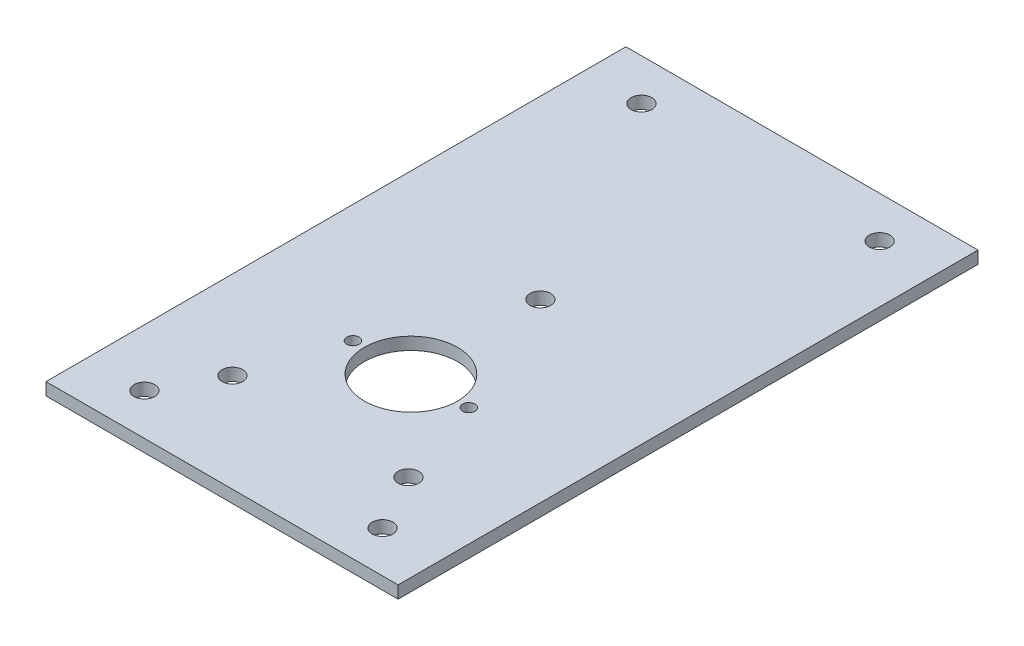
ISO-10303-21;
HEADER;
FILE_DESCRIPTION(('STEP AP214'),'2;1');
FILE_NAME('part.step','',(''),(''),'','','');
FILE_SCHEMA(('AUTOMOTIVE_DESIGN { 1 0 10303 214 1 1 1 1 }'));
ENDSEC;
DATA;
#1=APPLICATION_CONTEXT('core data for automotive mechanical design processes');
#2=APPLICATION_PROTOCOL_DEFINITION('international standard','automotive_design',2000,#1);
#3=PRODUCT_CONTEXT('',#1,'mechanical');
#4=PRODUCT('Part','Part','',(#3));
#5=PRODUCT_RELATED_PRODUCT_CATEGORY('part','',(#4));
#6=PRODUCT_DEFINITION_FORMATION('','',#4);
#7=PRODUCT_DEFINITION_CONTEXT('part definition',#1,'design');
#8=PRODUCT_DEFINITION('design','',#6,#7);
#9=PRODUCT_DEFINITION_SHAPE('','',#8);
#10=(LENGTH_UNIT() NAMED_UNIT(*) SI_UNIT(.MILLI.,.METRE.));
#11=(NAMED_UNIT(*) PLANE_ANGLE_UNIT() SI_UNIT($,.RADIAN.));
#12=(NAMED_UNIT(*) SI_UNIT($,.STERADIAN.) SOLID_ANGLE_UNIT());
#13=UNCERTAINTY_MEASURE_WITH_UNIT(LENGTH_MEASURE(1.E-05),#10,'distance_accuracy_value','');
#14=(GEOMETRIC_REPRESENTATION_CONTEXT(3) GLOBAL_UNCERTAINTY_ASSIGNED_CONTEXT((#13)) GLOBAL_UNIT_ASSIGNED_CONTEXT((#10,
#11,#12)) REPRESENTATION_CONTEXT('',''));
#15=CARTESIAN_POINT('',(0.,0.,0.));
#16=DIRECTION('',(0.,0.,1.));
#17=DIRECTION('',(1.,0.,0.));
#18=AXIS2_PLACEMENT_3D('',#15,#16,#17);
#19=CARTESIAN_POINT('',(85.,6.,140.));
#20=DIRECTION('',(-1.,0.,0.));
#21=DIRECTION('',(0.,0.,1.));
#22=AXIS2_PLACEMENT_3D('',#19,#20,#21);
#23=PLANE('',#22);
#24=DIRECTION('',(0.,0.,-1.));
#25=VECTOR('',#24,1.);
#26=CARTESIAN_POINT('',(85.,0.,140.));
#27=LINE('',#26,#25);
#28=CARTESIAN_POINT('',(85.,0.,140.));
#29=VERTEX_POINT('',#28);
#30=CARTESIAN_POINT('',(85.,0.,-140.));
#31=VERTEX_POINT('',#30);
#32=EDGE_CURVE('E103',#29,#31,#27,.T.);
#33=ORIENTED_EDGE('',*,*,#32,.T.);
#34=DIRECTION('',(0.,-1.,0.));
#35=VECTOR('',#34,1.);
#36=CARTESIAN_POINT('',(85.,6.,-140.));
#37=LINE('',#36,#35);
#38=CARTESIAN_POINT('',(85.,6.,-140.));
#39=VERTEX_POINT('',#38);
#40=EDGE_CURVE('E11',#39,#31,#37,.T.);
#41=ORIENTED_EDGE('',*,*,#40,.F.);
#42=DIRECTION('',(0.,0.,-1.));
#43=VECTOR('',#42,1.);
#44=CARTESIAN_POINT('',(85.,6.,140.));
#45=LINE('',#44,#43);
#46=CARTESIAN_POINT('',(85.,6.,140.));
#47=VERTEX_POINT('',#46);
#48=EDGE_CURVE('E90',#47,#39,#45,.T.);
#49=ORIENTED_EDGE('',*,*,#48,.F.);
#50=DIRECTION('',(0.,-1.,0.));
#51=VECTOR('',#50,1.);
#52=CARTESIAN_POINT('',(85.,6.,140.));
#53=LINE('',#52,#51);
#54=EDGE_CURVE('E99',#47,#29,#53,.T.);
#55=ORIENTED_EDGE('',*,*,#54,.T.);
#56=EDGE_LOOP('',(#33,#41,#49,#55));
#57=FACE_BOUND('',#56,.T.);
#58=ADVANCED_FACE('F37',(#57),#23,.F.);
#59=CARTESIAN_POINT('',(-85.,6.,-140.));
#60=DIRECTION('',(0.,0.,1.));
#61=DIRECTION('',(1.,0.,0.));
#62=AXIS2_PLACEMENT_3D('',#59,#60,#61);
#63=PLANE('',#62);
#64=DIRECTION('',(-1.,0.,0.));
#65=VECTOR('',#64,1.);
#66=CARTESIAN_POINT('',(-85.,0.,-140.));
#67=LINE('',#66,#65);
#68=CARTESIAN_POINT('',(-85.,0.,-140.));
#69=VERTEX_POINT('',#68);
#70=EDGE_CURVE('E94',#31,#69,#67,.T.);
#71=ORIENTED_EDGE('',*,*,#70,.T.);
#72=DIRECTION('',(0.,-1.,0.));
#73=VECTOR('',#72,1.);
#74=CARTESIAN_POINT('',(-85.,6.,-140.));
#75=LINE('',#74,#73);
#76=CARTESIAN_POINT('',(-85.,6.,-140.));
#77=VERTEX_POINT('',#76);
#78=EDGE_CURVE('E46',#77,#69,#75,.T.);
#79=ORIENTED_EDGE('',*,*,#78,.F.);
#80=DIRECTION('',(-1.,0.,0.));
#81=VECTOR('',#80,1.);
#82=CARTESIAN_POINT('',(-85.,6.,-140.));
#83=LINE('',#82,#81);
#84=EDGE_CURVE('E85',#39,#77,#83,.T.);
#85=ORIENTED_EDGE('',*,*,#84,.F.);
#86=ORIENTED_EDGE('',*,*,#40,.T.);
#87=EDGE_LOOP('',(#71,#79,#85,#86));
#88=FACE_BOUND('',#87,.T.);
#89=ADVANCED_FACE('F93',(#88),#63,.F.);
#90=CARTESIAN_POINT('',(-85.,6.,140.));
#91=DIRECTION('',(1.,0.,0.));
#92=DIRECTION('',(0.,0.,-1.));
#93=AXIS2_PLACEMENT_3D('',#90,#91,#92);
#94=PLANE('',#93);
#95=DIRECTION('',(0.,0.,1.));
#96=VECTOR('',#95,1.);
#97=CARTESIAN_POINT('',(-85.,0.,140.));
#98=LINE('',#97,#96);
#99=CARTESIAN_POINT('',(-85.,0.,140.));
#100=VERTEX_POINT('',#99);
#101=EDGE_CURVE('E72',#69,#100,#98,.T.);
#102=ORIENTED_EDGE('',*,*,#101,.T.);
#103=DIRECTION('',(0.,-1.,0.));
#104=VECTOR('',#103,1.);
#105=CARTESIAN_POINT('',(-85.,6.,140.));
#106=LINE('',#105,#104);
#107=CARTESIAN_POINT('',(-85.,6.,140.));
#108=VERTEX_POINT('',#107);
#109=EDGE_CURVE('E95',#108,#100,#106,.T.);
#110=ORIENTED_EDGE('',*,*,#109,.F.);
#111=DIRECTION('',(0.,0.,1.));
#112=VECTOR('',#111,1.);
#113=CARTESIAN_POINT('',(-85.,6.,140.));
#114=LINE('',#113,#112);
#115=EDGE_CURVE('E88',#77,#108,#114,.T.);
#116=ORIENTED_EDGE('',*,*,#115,.F.);
#117=ORIENTED_EDGE('',*,*,#78,.T.);
#118=EDGE_LOOP('',(#102,#110,#116,#117));
#119=FACE_BOUND('',#118,.T.);
#120=ADVANCED_FACE('F97',(#119),#94,.F.);
#121=CARTESIAN_POINT('',(-85.,6.,140.));
#122=DIRECTION('',(0.,0.,-1.));
#123=DIRECTION('',(-1.,0.,0.));
#124=AXIS2_PLACEMENT_3D('',#121,#122,#123);
#125=PLANE('',#124);
#126=DIRECTION('',(1.,0.,0.));
#127=VECTOR('',#126,1.);
#128=CARTESIAN_POINT('',(-85.,0.,140.));
#129=LINE('',#128,#127);
#130=EDGE_CURVE('E78',#100,#29,#129,.T.);
#131=ORIENTED_EDGE('',*,*,#130,.T.);
#132=ORIENTED_EDGE('',*,*,#54,.F.);
#133=DIRECTION('',(1.,0.,0.));
#134=VECTOR('',#133,1.);
#135=CARTESIAN_POINT('',(-85.,6.,140.));
#136=LINE('',#135,#134);
#137=EDGE_CURVE('E55',#108,#47,#136,.T.);
#138=ORIENTED_EDGE('',*,*,#137,.F.);
#139=ORIENTED_EDGE('',*,*,#109,.T.);
#140=EDGE_LOOP('',(#131,#132,#138,#139));
#141=FACE_BOUND('',#140,.T.);
#142=ADVANCED_FACE('F168',(#141),#125,.F.);
#143=CARTESIAN_POINT('',(0.,6.,0.));
#144=DIRECTION('',(0.,-1.,0.));
#145=DIRECTION('',(0.,0.,-1.));
#146=AXIS2_PLACEMENT_3D('',#143,#144,#145);
#147=PLANE('',#146);
#148=CARTESIAN_POINT('',(-28.,6.,48.8));
#149=DIRECTION('',(0.,1.,0.));
#150=DIRECTION('',(0.,0.,1.));
#151=AXIS2_PLACEMENT_3D('',#148,#149,#150);
#152=CIRCLE('',#151,3.);
#153=CARTESIAN_POINT('',(-28.,6.,51.8));
#154=VERTEX_POINT('',#153);
#155=EDGE_CURVE('E310',#154,#154,#152,.T.);
#156=ORIENTED_EDGE('',*,*,#155,.F.);
#157=EDGE_LOOP('',(#156));
#158=FACE_BOUND('',#157,.T.);
#159=CARTESIAN_POINT('',(27.9999999999999,6.,48.8));
#160=DIRECTION('',(0.,1.,0.));
#161=DIRECTION('',(0.,0.,1.));
#162=AXIS2_PLACEMENT_3D('',#159,#160,#161);
#163=CIRCLE('',#162,3.);
#164=CARTESIAN_POINT('',(27.9999999999999,6.,51.8));
#165=VERTEX_POINT('',#164);
#166=EDGE_CURVE('E311',#165,#165,#163,.T.);
#167=ORIENTED_EDGE('',*,*,#166,.F.);
#168=EDGE_LOOP('',(#167));
#169=FACE_BOUND('',#168,.T.);
#170=CARTESIAN_POINT('',(0.,6.,48.8));
#171=DIRECTION('',(0.,1.,0.));
#172=DIRECTION('',(0.,0.,1.));
#173=AXIS2_PLACEMENT_3D('',#170,#171,#172);
#174=CIRCLE('',#173,22.5);
#175=CARTESIAN_POINT('',(0.,6.,71.3));
#176=VERTEX_POINT('',#175);
#177=EDGE_CURVE('E115',#176,#176,#174,.T.);
#178=ORIENTED_EDGE('',*,*,#177,.F.);
#179=EDGE_LOOP('',(#178));
#180=FACE_BOUND('',#179,.T.);
#181=CARTESIAN_POINT('',(57.5,6.,-120.));
#182=DIRECTION('',(0.,1.,0.));
#183=DIRECTION('',(0.,0.,1.));
#184=AXIS2_PLACEMENT_3D('',#181,#182,#183);
#185=CIRCLE('',#184,5.00000000000001);
#186=CARTESIAN_POINT('',(57.5,6.,-115.));
#187=VERTEX_POINT('',#186);
#188=EDGE_CURVE('E137',#187,#187,#185,.T.);
#189=ORIENTED_EDGE('',*,*,#188,.F.);
#190=EDGE_LOOP('',(#189));
#191=FACE_BOUND('',#190,.T.);
#192=CARTESIAN_POINT('',(0.,6.,-13.7));
#193=DIRECTION('',(0.,1.,0.));
#194=DIRECTION('',(0.,0.,1.));
#195=AXIS2_PLACEMENT_3D('',#192,#193,#194);
#196=CIRCLE('',#195,5.);
#197=CARTESIAN_POINT('',(0.,6.,-8.70000000000001));
#198=VERTEX_POINT('',#197);
#199=EDGE_CURVE('E143',#198,#198,#196,.T.);
#200=ORIENTED_EDGE('',*,*,#199,.F.);
#201=EDGE_LOOP('',(#200));
#202=FACE_BOUND('',#201,.T.);
#203=CARTESIAN_POINT('',(-57.5,6.,120.));
#204=DIRECTION('',(0.,1.,0.));
#205=DIRECTION('',(0.,0.,1.));
#206=AXIS2_PLACEMENT_3D('',#203,#204,#205);
#207=CIRCLE('',#206,5.);
#208=CARTESIAN_POINT('',(-57.5,6.,125.));
#209=VERTEX_POINT('',#208);
#210=EDGE_CURVE('E149',#209,#209,#207,.T.);
#211=ORIENTED_EDGE('',*,*,#210,.F.);
#212=EDGE_LOOP('',(#211));
#213=FACE_BOUND('',#212,.T.);
#214=CARTESIAN_POINT('',(57.5000000000001,6.,120.));
#215=DIRECTION('',(0.,1.,0.));
#216=DIRECTION('',(0.,0.,1.));
#217=AXIS2_PLACEMENT_3D('',#214,#215,#216);
#218=CIRCLE('',#217,5.);
#219=CARTESIAN_POINT('',(57.5000000000001,6.,125.));
#220=VERTEX_POINT('',#219);
#221=EDGE_CURVE('E155',#220,#220,#218,.T.);
#222=ORIENTED_EDGE('',*,*,#221,.F.);
#223=EDGE_LOOP('',(#222));
#224=FACE_BOUND('',#223,.T.);
#225=CARTESIAN_POINT('',(42.5,6.,92.5));
#226=DIRECTION('',(0.,1.,0.));
#227=DIRECTION('',(0.,0.,1.));
#228=AXIS2_PLACEMENT_3D('',#225,#226,#227);
#229=CIRCLE('',#228,5.00000000000001);
#230=CARTESIAN_POINT('',(42.5,6.,97.5));
#231=VERTEX_POINT('',#230);
#232=EDGE_CURVE('E129',#231,#231,#229,.T.);
#233=ORIENTED_EDGE('',*,*,#232,.F.);
#234=EDGE_LOOP('',(#233));
#235=FACE_BOUND('',#234,.T.);
#236=CARTESIAN_POINT('',(-42.5,6.,92.5));
#237=DIRECTION('',(0.,1.,0.));
#238=DIRECTION('',(0.,0.,1.));
#239=AXIS2_PLACEMENT_3D('',#236,#237,#238);
#240=CIRCLE('',#239,5.00000000000001);
#241=CARTESIAN_POINT('',(-42.5,6.,97.5));
#242=VERTEX_POINT('',#241);
#243=EDGE_CURVE('E120',#242,#242,#240,.T.);
#244=ORIENTED_EDGE('',*,*,#243,.F.);
#245=EDGE_LOOP('',(#244));
#246=FACE_BOUND('',#245,.T.);
#247=CARTESIAN_POINT('',(-57.5,6.,-120.));
#248=DIRECTION('',(0.,1.,0.));
#249=DIRECTION('',(0.,0.,1.));
#250=AXIS2_PLACEMENT_3D('',#247,#248,#249);
#251=CIRCLE('',#250,5.);
#252=CARTESIAN_POINT('',(-57.5,6.,-115.));
#253=VERTEX_POINT('',#252);
#254=EDGE_CURVE('E136',#253,#253,#251,.T.);
#255=ORIENTED_EDGE('',*,*,#254,.F.);
#256=EDGE_LOOP('',(#255));
#257=FACE_BOUND('',#256,.T.);
#258=ORIENTED_EDGE('',*,*,#48,.T.);
#259=ORIENTED_EDGE('',*,*,#84,.T.);
#260=ORIENTED_EDGE('',*,*,#115,.T.);
#261=ORIENTED_EDGE('',*,*,#137,.T.);
#262=EDGE_LOOP('',(#258,#259,#260,#261));
#263=FACE_BOUND('',#262,.T.);
#264=ADVANCED_FACE('F86',(#158,#169,#180,#191,#202,#213,#224,#235,#246,#257,#263),#147,.F.);
#265=CARTESIAN_POINT('',(0.,0.,0.));
#266=DIRECTION('',(0.,-1.,0.));
#267=DIRECTION('',(0.,0.,-1.));
#268=AXIS2_PLACEMENT_3D('',#265,#266,#267);
#269=PLANE('',#268);
#270=CARTESIAN_POINT('',(-28.,0.,48.8));
#271=DIRECTION('',(0.,-1.,0.));
#272=DIRECTION('',(0.,0.,-1.));
#273=AXIS2_PLACEMENT_3D('',#270,#271,#272);
#274=CIRCLE('',#273,3.);
#275=CARTESIAN_POINT('',(-28.,0.,45.8));
#276=VERTEX_POINT('',#275);
#277=EDGE_CURVE('E40',#276,#276,#274,.T.);
#278=ORIENTED_EDGE('',*,*,#277,.F.);
#279=EDGE_LOOP('',(#278));
#280=FACE_BOUND('',#279,.T.);
#281=CARTESIAN_POINT('',(27.9999999999999,0.,48.8));
#282=DIRECTION('',(0.,-1.,0.));
#283=DIRECTION('',(0.,0.,-1.));
#284=AXIS2_PLACEMENT_3D('',#281,#282,#283);
#285=CIRCLE('',#284,3.);
#286=CARTESIAN_POINT('',(27.9999999999999,0.,45.8));
#287=VERTEX_POINT('',#286);
#288=EDGE_CURVE('E114',#287,#287,#285,.T.);
#289=ORIENTED_EDGE('',*,*,#288,.F.);
#290=EDGE_LOOP('',(#289));
#291=FACE_BOUND('',#290,.T.);
#292=CARTESIAN_POINT('',(0.,0.,48.8));
#293=DIRECTION('',(0.,-1.,0.));
#294=DIRECTION('',(0.,0.,-1.));
#295=AXIS2_PLACEMENT_3D('',#292,#293,#294);
#296=CIRCLE('',#295,22.5);
#297=CARTESIAN_POINT('',(0.,0.,26.3));
#298=VERTEX_POINT('',#297);
#299=EDGE_CURVE('E112',#298,#298,#296,.T.);
#300=ORIENTED_EDGE('',*,*,#299,.F.);
#301=EDGE_LOOP('',(#300));
#302=FACE_BOUND('',#301,.T.);
#303=CARTESIAN_POINT('',(57.5,0.,-120.));
#304=DIRECTION('',(0.,1.,0.));
#305=DIRECTION('',(0.,0.,1.));
#306=AXIS2_PLACEMENT_3D('',#303,#304,#305);
#307=CIRCLE('',#306,5.00000000000001);
#308=CARTESIAN_POINT('',(57.5,0.,-115.));
#309=VERTEX_POINT('',#308);
#310=EDGE_CURVE('E133',#309,#309,#307,.T.);
#311=ORIENTED_EDGE('',*,*,#310,.T.);
#312=EDGE_LOOP('',(#311));
#313=FACE_BOUND('',#312,.T.);
#314=CARTESIAN_POINT('',(0.,0.,-13.7));
#315=DIRECTION('',(0.,1.,0.));
#316=DIRECTION('',(0.,0.,1.));
#317=AXIS2_PLACEMENT_3D('',#314,#315,#316);
#318=CIRCLE('',#317,5.);
#319=CARTESIAN_POINT('',(0.,0.,-8.70000000000001));
#320=VERTEX_POINT('',#319);
#321=EDGE_CURVE('E140',#320,#320,#318,.T.);
#322=ORIENTED_EDGE('',*,*,#321,.T.);
#323=EDGE_LOOP('',(#322));
#324=FACE_BOUND('',#323,.T.);
#325=CARTESIAN_POINT('',(-57.5,0.,120.));
#326=DIRECTION('',(0.,1.,0.));
#327=DIRECTION('',(0.,0.,1.));
#328=AXIS2_PLACEMENT_3D('',#325,#326,#327);
#329=CIRCLE('',#328,5.);
#330=CARTESIAN_POINT('',(-57.5,0.,125.));
#331=VERTEX_POINT('',#330);
#332=EDGE_CURVE('E146',#331,#331,#329,.T.);
#333=ORIENTED_EDGE('',*,*,#332,.T.);
#334=EDGE_LOOP('',(#333));
#335=FACE_BOUND('',#334,.T.);
#336=CARTESIAN_POINT('',(57.5000000000001,0.,120.));
#337=DIRECTION('',(0.,1.,0.));
#338=DIRECTION('',(0.,0.,1.));
#339=AXIS2_PLACEMENT_3D('',#336,#337,#338);
#340=CIRCLE('',#339,5.);
#341=CARTESIAN_POINT('',(57.5000000000001,0.,125.));
#342=VERTEX_POINT('',#341);
#343=EDGE_CURVE('E152',#342,#342,#340,.T.);
#344=ORIENTED_EDGE('',*,*,#343,.T.);
#345=EDGE_LOOP('',(#344));
#346=FACE_BOUND('',#345,.T.);
#347=CARTESIAN_POINT('',(42.5,0.,92.5));
#348=DIRECTION('',(0.,1.,0.));
#349=DIRECTION('',(0.,0.,1.));
#350=AXIS2_PLACEMENT_3D('',#347,#348,#349);
#351=CIRCLE('',#350,5.00000000000001);
#352=CARTESIAN_POINT('',(42.5,0.,97.5));
#353=VERTEX_POINT('',#352);
#354=EDGE_CURVE('E158',#353,#353,#351,.T.);
#355=ORIENTED_EDGE('',*,*,#354,.T.);
#356=EDGE_LOOP('',(#355));
#357=FACE_BOUND('',#356,.T.);
#358=CARTESIAN_POINT('',(-42.5,0.,92.5));
#359=DIRECTION('',(0.,1.,0.));
#360=DIRECTION('',(0.,0.,1.));
#361=AXIS2_PLACEMENT_3D('',#358,#359,#360);
#362=CIRCLE('',#361,5.00000000000001);
#363=CARTESIAN_POINT('',(-42.5,0.,97.5));
#364=VERTEX_POINT('',#363);
#365=EDGE_CURVE('E124',#364,#364,#362,.T.);
#366=ORIENTED_EDGE('',*,*,#365,.T.);
#367=EDGE_LOOP('',(#366));
#368=FACE_BOUND('',#367,.T.);
#369=CARTESIAN_POINT('',(-57.5,0.,-120.));
#370=DIRECTION('',(0.,1.,0.));
#371=DIRECTION('',(0.,0.,1.));
#372=AXIS2_PLACEMENT_3D('',#369,#370,#371);
#373=CIRCLE('',#372,5.);
#374=CARTESIAN_POINT('',(-57.5,0.,-115.));
#375=VERTEX_POINT('',#374);
#376=EDGE_CURVE('E106',#375,#375,#373,.T.);
#377=ORIENTED_EDGE('',*,*,#376,.T.);
#378=EDGE_LOOP('',(#377));
#379=FACE_BOUND('',#378,.T.);
#380=ORIENTED_EDGE('',*,*,#32,.F.);
#381=ORIENTED_EDGE('',*,*,#130,.F.);
#382=ORIENTED_EDGE('',*,*,#101,.F.);
#383=ORIENTED_EDGE('',*,*,#70,.F.);
#384=EDGE_LOOP('',(#380,#381,#382,#383));
#385=FACE_BOUND('',#384,.T.);
#386=ADVANCED_FACE('F167',(#280,#291,#302,#313,#324,#335,#346,#357,#368,#379,#385),#269,.T.);
#387=CARTESIAN_POINT('',(-57.5,0.,-120.));
#388=DIRECTION('',(0.,1.,0.));
#389=DIRECTION('',(0.,0.,1.));
#390=AXIS2_PLACEMENT_3D('',#387,#388,#389);
#391=CYLINDRICAL_SURFACE('',#390,5.);
#392=ORIENTED_EDGE('',*,*,#376,.F.);
#393=EDGE_LOOP('',(#392));
#394=FACE_BOUND('',#393,.T.);
#395=ORIENTED_EDGE('',*,*,#254,.T.);
#396=EDGE_LOOP('',(#395));
#397=FACE_BOUND('',#396,.T.);
#398=ADVANCED_FACE('F164',(#394,#397),#391,.F.);
#399=CARTESIAN_POINT('',(-42.5,0.,92.5));
#400=DIRECTION('',(0.,1.,0.));
#401=DIRECTION('',(0.,0.,1.));
#402=AXIS2_PLACEMENT_3D('',#399,#400,#401);
#403=CYLINDRICAL_SURFACE('',#402,5.00000000000001);
#404=ORIENTED_EDGE('',*,*,#365,.F.);
#405=EDGE_LOOP('',(#404));
#406=FACE_BOUND('',#405,.T.);
#407=ORIENTED_EDGE('',*,*,#243,.T.);
#408=EDGE_LOOP('',(#407));
#409=FACE_BOUND('',#408,.T.);
#410=ADVANCED_FACE('F208',(#406,#409),#403,.F.);
#411=CARTESIAN_POINT('',(42.5,0.,92.5));
#412=DIRECTION('',(0.,1.,0.));
#413=DIRECTION('',(0.,0.,1.));
#414=AXIS2_PLACEMENT_3D('',#411,#412,#413);
#415=CYLINDRICAL_SURFACE('',#414,5.00000000000001);
#416=ORIENTED_EDGE('',*,*,#354,.F.);
#417=EDGE_LOOP('',(#416));
#418=FACE_BOUND('',#417,.T.);
#419=ORIENTED_EDGE('',*,*,#232,.T.);
#420=EDGE_LOOP('',(#419));
#421=FACE_BOUND('',#420,.T.);
#422=ADVANCED_FACE('F218',(#418,#421),#415,.F.);
#423=CARTESIAN_POINT('',(57.5000000000001,0.,120.));
#424=DIRECTION('',(0.,1.,0.));
#425=DIRECTION('',(0.,0.,1.));
#426=AXIS2_PLACEMENT_3D('',#423,#424,#425);
#427=CYLINDRICAL_SURFACE('',#426,5.);
#428=ORIENTED_EDGE('',*,*,#343,.F.);
#429=EDGE_LOOP('',(#428));
#430=FACE_BOUND('',#429,.T.);
#431=ORIENTED_EDGE('',*,*,#221,.T.);
#432=EDGE_LOOP('',(#431));
#433=FACE_BOUND('',#432,.T.);
#434=ADVANCED_FACE('F228',(#430,#433),#427,.F.);
#435=CARTESIAN_POINT('',(-57.5,0.,120.));
#436=DIRECTION('',(0.,1.,0.));
#437=DIRECTION('',(0.,0.,1.));
#438=AXIS2_PLACEMENT_3D('',#435,#436,#437);
#439=CYLINDRICAL_SURFACE('',#438,5.);
#440=ORIENTED_EDGE('',*,*,#332,.F.);
#441=EDGE_LOOP('',(#440));
#442=FACE_BOUND('',#441,.T.);
#443=ORIENTED_EDGE('',*,*,#210,.T.);
#444=EDGE_LOOP('',(#443));
#445=FACE_BOUND('',#444,.T.);
#446=ADVANCED_FACE('F238',(#442,#445),#439,.F.);
#447=CARTESIAN_POINT('',(0.,0.,-13.7));
#448=DIRECTION('',(0.,1.,0.));
#449=DIRECTION('',(0.,0.,1.));
#450=AXIS2_PLACEMENT_3D('',#447,#448,#449);
#451=CYLINDRICAL_SURFACE('',#450,5.);
#452=ORIENTED_EDGE('',*,*,#321,.F.);
#453=EDGE_LOOP('',(#452));
#454=FACE_BOUND('',#453,.T.);
#455=ORIENTED_EDGE('',*,*,#199,.T.);
#456=EDGE_LOOP('',(#455));
#457=FACE_BOUND('',#456,.T.);
#458=ADVANCED_FACE('F248',(#454,#457),#451,.F.);
#459=CARTESIAN_POINT('',(57.5,0.,-120.));
#460=DIRECTION('',(0.,1.,0.));
#461=DIRECTION('',(0.,0.,1.));
#462=AXIS2_PLACEMENT_3D('',#459,#460,#461);
#463=CYLINDRICAL_SURFACE('',#462,5.00000000000001);
#464=ORIENTED_EDGE('',*,*,#310,.F.);
#465=EDGE_LOOP('',(#464));
#466=FACE_BOUND('',#465,.T.);
#467=ORIENTED_EDGE('',*,*,#188,.T.);
#468=EDGE_LOOP('',(#467));
#469=FACE_BOUND('',#468,.T.);
#470=ADVANCED_FACE('F258',(#466,#469),#463,.F.);
#471=CARTESIAN_POINT('',(0.,-4.,48.8));
#472=DIRECTION('',(0.,1.,0.));
#473=DIRECTION('',(0.,0.,1.));
#474=AXIS2_PLACEMENT_3D('',#471,#472,#473);
#475=CYLINDRICAL_SURFACE('',#474,22.5);
#476=ORIENTED_EDGE('',*,*,#299,.T.);
#477=EDGE_LOOP('',(#476));
#478=FACE_BOUND('',#477,.T.);
#479=ORIENTED_EDGE('',*,*,#177,.T.);
#480=EDGE_LOOP('',(#479));
#481=FACE_BOUND('',#480,.T.);
#482=ADVANCED_FACE('F267',(#478,#481),#475,.F.);
#483=CARTESIAN_POINT('',(27.9999999999999,-4.,48.8));
#484=DIRECTION('',(0.,1.,0.));
#485=DIRECTION('',(0.,0.,1.));
#486=AXIS2_PLACEMENT_3D('',#483,#484,#485);
#487=CYLINDRICAL_SURFACE('',#486,3.);
#488=ORIENTED_EDGE('',*,*,#288,.T.);
#489=EDGE_LOOP('',(#488));
#490=FACE_BOUND('',#489,.T.);
#491=ORIENTED_EDGE('',*,*,#166,.T.);
#492=EDGE_LOOP('',(#491));
#493=FACE_BOUND('',#492,.T.);
#494=ADVANCED_FACE('F286',(#490,#493),#487,.F.);
#495=CARTESIAN_POINT('',(-28.,-4.,48.8));
#496=DIRECTION('',(0.,1.,0.));
#497=DIRECTION('',(0.,0.,1.));
#498=AXIS2_PLACEMENT_3D('',#495,#496,#497);
#499=CYLINDRICAL_SURFACE('',#498,3.);
#500=ORIENTED_EDGE('',*,*,#277,.T.);
#501=EDGE_LOOP('',(#500));
#502=FACE_BOUND('',#501,.T.);
#503=ORIENTED_EDGE('',*,*,#155,.T.);
#504=EDGE_LOOP('',(#503));
#505=FACE_BOUND('',#504,.T.);
#506=ADVANCED_FACE('F296',(#502,#505),#499,.F.);
#507=CLOSED_SHELL('',(#58,#89,#120,#142,#264,#386,#398,#410,#422,#434,#446,#458,#470,#482,#494,#506));
#508=MANIFOLD_SOLID_BREP('B2',#507);
#509=ADVANCED_BREP_SHAPE_REPRESENTATION('',(#18,#508),#14);
#510=SHAPE_DEFINITION_REPRESENTATION(#9,#509);
ENDSEC;
END-ISO-10303-21;
